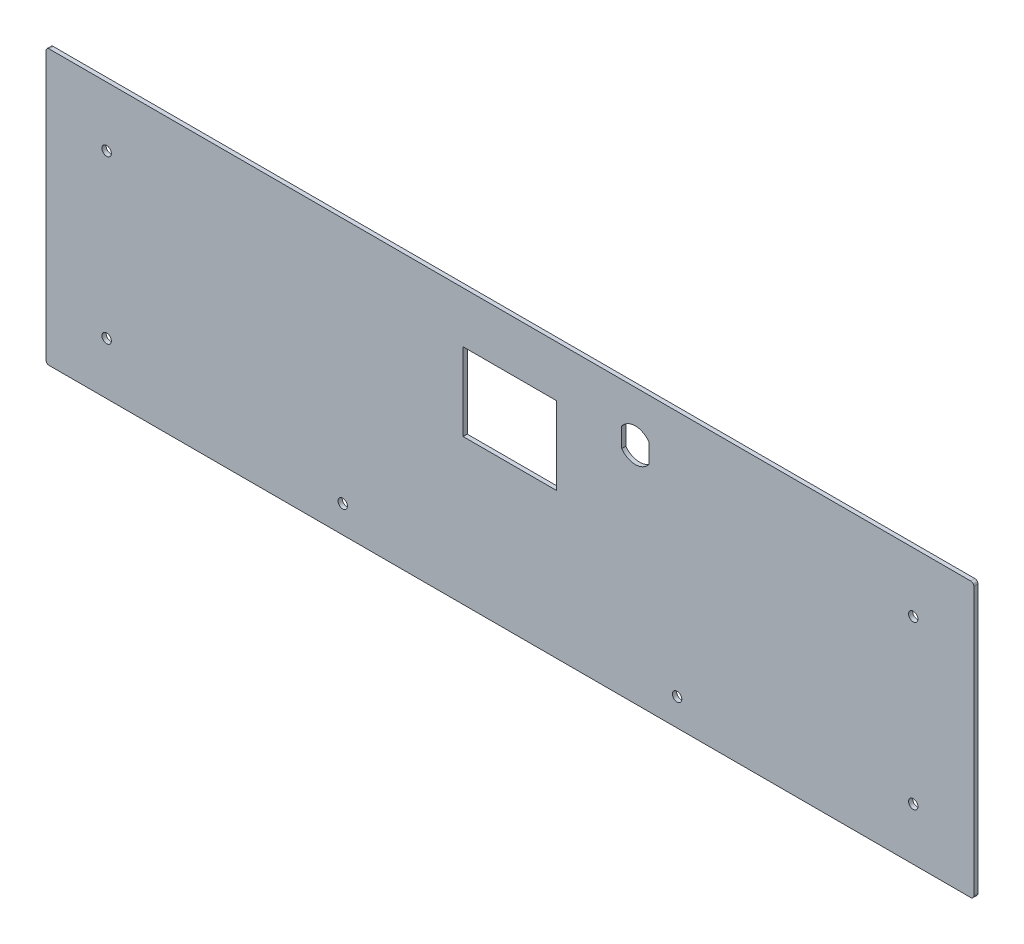
ISO-10303-21;
HEADER;
FILE_DESCRIPTION(('STEP AP214'),'2;1');
FILE_NAME('part.step','',(''),(''),'','','');
FILE_SCHEMA(('AUTOMOTIVE_DESIGN { 1 0 10303 214 1 1 1 1 }'));
ENDSEC;
DATA;
#1=APPLICATION_CONTEXT('core data for automotive mechanical design processes');
#2=APPLICATION_PROTOCOL_DEFINITION('international standard','automotive_design',2000,#1);
#3=PRODUCT_CONTEXT('',#1,'mechanical');
#4=PRODUCT('Part','Part','',(#3));
#5=PRODUCT_RELATED_PRODUCT_CATEGORY('part','',(#4));
#6=PRODUCT_DEFINITION_FORMATION('','',#4);
#7=PRODUCT_DEFINITION_CONTEXT('part definition',#1,'design');
#8=PRODUCT_DEFINITION('design','',#6,#7);
#9=PRODUCT_DEFINITION_SHAPE('','',#8);
#10=(LENGTH_UNIT() NAMED_UNIT(*) SI_UNIT(.MILLI.,.METRE.));
#11=(NAMED_UNIT(*) PLANE_ANGLE_UNIT() SI_UNIT($,.RADIAN.));
#12=(NAMED_UNIT(*) SI_UNIT($,.STERADIAN.) SOLID_ANGLE_UNIT());
#13=UNCERTAINTY_MEASURE_WITH_UNIT(LENGTH_MEASURE(1.E-05),#10,'distance_accuracy_value','');
#14=(GEOMETRIC_REPRESENTATION_CONTEXT(3) GLOBAL_UNCERTAINTY_ASSIGNED_CONTEXT((#13)) GLOBAL_UNIT_ASSIGNED_CONTEXT((#10,
#11,#12)) REPRESENTATION_CONTEXT('',''));
#15=CARTESIAN_POINT('',(0.,0.,0.));
#16=DIRECTION('',(0.,0.,1.));
#17=DIRECTION('',(1.,0.,0.));
#18=AXIS2_PLACEMENT_3D('',#15,#16,#17);
#19=CARTESIAN_POINT('',(0.,0.,-2.));
#20=DIRECTION('',(0.,0.,-1.));
#21=DIRECTION('',(-1.,0.,0.));
#22=AXIS2_PLACEMENT_3D('',#19,#20,#21);
#23=PLANE('',#22);
#24=CARTESIAN_POINT('',(-80.,13.,-2.));
#25=DIRECTION('',(0.,0.,1.));
#26=DIRECTION('',(1.,0.,0.));
#27=AXIS2_PLACEMENT_3D('',#24,#25,#26);
#28=CIRCLE('',#27,2.25);
#29=CARTESIAN_POINT('',(-77.75,13.,-2.));
#30=VERTEX_POINT('',#29);
#31=EDGE_CURVE('E179',#30,#30,#28,.T.);
#32=ORIENTED_EDGE('',*,*,#31,.T.);
#33=EDGE_LOOP('',(#32));
#34=FACE_BOUND('',#33,.T.);
#35=CARTESIAN_POINT('',(-193.,25.,-2.));
#36=DIRECTION('',(0.,0.,1.));
#37=DIRECTION('',(1.,0.,0.));
#38=AXIS2_PLACEMENT_3D('',#35,#36,#37);
#39=CIRCLE('',#38,2.25);
#40=CARTESIAN_POINT('',(-190.75,25.,-2.));
#41=VERTEX_POINT('',#40);
#42=EDGE_CURVE('E182',#41,#41,#39,.T.);
#43=ORIENTED_EDGE('',*,*,#42,.T.);
#44=EDGE_LOOP('',(#43));
#45=FACE_BOUND('',#44,.T.);
#46=CARTESIAN_POINT('',(-193.,102.7,-2.));
#47=DIRECTION('',(0.,0.,1.));
#48=DIRECTION('',(1.,0.,0.));
#49=AXIS2_PLACEMENT_3D('',#46,#47,#48);
#50=CIRCLE('',#49,2.25);
#51=CARTESIAN_POINT('',(-190.75,102.7,-2.));
#52=VERTEX_POINT('',#51);
#53=EDGE_CURVE('E185',#52,#52,#50,.T.);
#54=ORIENTED_EDGE('',*,*,#53,.T.);
#55=EDGE_LOOP('',(#54));
#56=FACE_BOUND('',#55,.T.);
#57=DIRECTION('',(1.,0.,0.));
#58=VECTOR('',#57,1.);
#59=CARTESIAN_POINT('',(0.,0.,-2.));
#60=LINE('',#59,#58);
#61=CARTESIAN_POINT('',(-220.5,0.,-2.));
#62=VERTEX_POINT('',#61);
#63=CARTESIAN_POINT('',(220.5,0.,-2.));
#64=VERTEX_POINT('',#63);
#65=EDGE_CURVE('E221',#62,#64,#60,.T.);
#66=ORIENTED_EDGE('',*,*,#65,.F.);
#67=CARTESIAN_POINT('',(-220.5,1.5,-2.));
#68=DIRECTION('',(0.,0.,1.));
#69=DIRECTION('',(1.,0.,0.));
#70=AXIS2_PLACEMENT_3D('',#67,#68,#69);
#71=CIRCLE('',#70,1.5);
#72=CARTESIAN_POINT('',(-222.,1.5,-2.));
#73=VERTEX_POINT('',#72);
#74=EDGE_CURVE('E193',#73,#62,#71,.T.);
#75=ORIENTED_EDGE('',*,*,#74,.F.);
#76=DIRECTION('',(0.,1.,0.));
#77=VECTOR('',#76,1.);
#78=CARTESIAN_POINT('',(-222.,0.,-2.));
#79=LINE('',#78,#77);
#80=CARTESIAN_POINT('',(-222.,129.7,-2.));
#81=VERTEX_POINT('',#80);
#82=EDGE_CURVE('E220',#81,#73,#79,.F.);
#83=ORIENTED_EDGE('',*,*,#82,.F.);
#84=CARTESIAN_POINT('',(-220.5,129.7,-2.));
#85=DIRECTION('',(0.,0.,1.));
#86=DIRECTION('',(1.,0.,0.));
#87=AXIS2_PLACEMENT_3D('',#84,#85,#86);
#88=CIRCLE('',#87,1.5);
#89=CARTESIAN_POINT('',(-220.5,131.2,-2.));
#90=VERTEX_POINT('',#89);
#91=EDGE_CURVE('E189',#90,#81,#88,.T.);
#92=ORIENTED_EDGE('',*,*,#91,.F.);
#93=DIRECTION('',(1.,0.,0.));
#94=VECTOR('',#93,1.);
#95=CARTESIAN_POINT('',(0.,131.2,-2.));
#96=LINE('',#95,#94);
#97=CARTESIAN_POINT('',(220.5,131.2,-2.));
#98=VERTEX_POINT('',#97);
#99=EDGE_CURVE('E218',#98,#90,#96,.F.);
#100=ORIENTED_EDGE('',*,*,#99,.F.);
#101=CARTESIAN_POINT('',(220.5,129.7,-2.));
#102=DIRECTION('',(0.,0.,1.));
#103=DIRECTION('',(1.,0.,0.));
#104=AXIS2_PLACEMENT_3D('',#101,#102,#103);
#105=CIRCLE('',#104,1.5);
#106=CARTESIAN_POINT('',(222.,129.7,-2.));
#107=VERTEX_POINT('',#106);
#108=EDGE_CURVE('E201',#107,#98,#105,.T.);
#109=ORIENTED_EDGE('',*,*,#108,.F.);
#110=DIRECTION('',(0.,1.,0.));
#111=VECTOR('',#110,1.);
#112=CARTESIAN_POINT('',(222.,0.,-2.));
#113=LINE('',#112,#111);
#114=CARTESIAN_POINT('',(222.,1.5,-2.));
#115=VERTEX_POINT('',#114);
#116=EDGE_CURVE('E137',#115,#107,#113,.T.);
#117=ORIENTED_EDGE('',*,*,#116,.F.);
#118=CARTESIAN_POINT('',(220.5,1.5,-2.));
#119=DIRECTION('',(0.,0.,1.));
#120=DIRECTION('',(1.,0.,0.));
#121=AXIS2_PLACEMENT_3D('',#118,#119,#120);
#122=CIRCLE('',#121,1.5);
#123=EDGE_CURVE('E197',#64,#115,#122,.T.);
#124=ORIENTED_EDGE('',*,*,#123,.F.);
#125=EDGE_LOOP('',(#66,#75,#83,#92,#100,#109,#117,#124));
#126=FACE_BOUND('',#125,.T.);
#127=CARTESIAN_POINT('',(80.,13.,-2.));
#128=DIRECTION('',(0.,0.,1.));
#129=DIRECTION('',(1.,0.,0.));
#130=AXIS2_PLACEMENT_3D('',#127,#128,#129);
#131=CIRCLE('',#130,2.25);
#132=CARTESIAN_POINT('',(82.25,13.,-2.));
#133=VERTEX_POINT('',#132);
#134=EDGE_CURVE('E203',#133,#133,#131,.T.);
#135=ORIENTED_EDGE('',*,*,#134,.T.);
#136=EDGE_LOOP('',(#135));
#137=FACE_BOUND('',#136,.T.);
#138=CARTESIAN_POINT('',(193.,25.,-2.));
#139=DIRECTION('',(0.,0.,1.));
#140=DIRECTION('',(1.,0.,0.));
#141=AXIS2_PLACEMENT_3D('',#138,#139,#140);
#142=CIRCLE('',#141,2.25);
#143=CARTESIAN_POINT('',(195.25,25.,-2.));
#144=VERTEX_POINT('',#143);
#145=EDGE_CURVE('E206',#144,#144,#142,.T.);
#146=ORIENTED_EDGE('',*,*,#145,.T.);
#147=EDGE_LOOP('',(#146));
#148=FACE_BOUND('',#147,.T.);
#149=CARTESIAN_POINT('',(193.,102.7,-2.));
#150=DIRECTION('',(0.,0.,1.));
#151=DIRECTION('',(1.,0.,0.));
#152=AXIS2_PLACEMENT_3D('',#149,#150,#151);
#153=CIRCLE('',#152,2.25);
#154=CARTESIAN_POINT('',(195.25,102.7,-2.));
#155=VERTEX_POINT('',#154);
#156=EDGE_CURVE('E209',#155,#155,#153,.T.);
#157=ORIENTED_EDGE('',*,*,#156,.T.);
#158=EDGE_LOOP('',(#157));
#159=FACE_BOUND('',#158,.T.);
#160=DIRECTION('',(0.,-1.,0.));
#161=VECTOR('',#160,1.);
#162=CARTESIAN_POINT('',(-22.4,106.8,-2.));
#163=LINE('',#162,#161);
#164=CARTESIAN_POINT('',(-22.4,106.8,-2.));
#165=VERTEX_POINT('',#164);
#166=CARTESIAN_POINT('',(-22.4,69.6,-2.));
#167=VERTEX_POINT('',#166);
#168=EDGE_CURVE('E129',#165,#167,#163,.T.);
#169=ORIENTED_EDGE('',*,*,#168,.T.);
#170=DIRECTION('',(1.,0.,0.));
#171=VECTOR('',#170,1.);
#172=CARTESIAN_POINT('',(-22.4,69.6,-2.));
#173=LINE('',#172,#171);
#174=CARTESIAN_POINT('',(22.4,69.6,-2.));
#175=VERTEX_POINT('',#174);
#176=EDGE_CURVE('E248',#167,#175,#173,.T.);
#177=ORIENTED_EDGE('',*,*,#176,.T.);
#178=DIRECTION('',(0.,1.,0.));
#179=VECTOR('',#178,1.);
#180=CARTESIAN_POINT('',(22.4,106.8,-2.));
#181=LINE('',#180,#179);
#182=CARTESIAN_POINT('',(22.4,106.8,-2.));
#183=VERTEX_POINT('',#182);
#184=EDGE_CURVE('E242',#175,#183,#181,.T.);
#185=ORIENTED_EDGE('',*,*,#184,.T.);
#186=DIRECTION('',(1.,0.,0.));
#187=VECTOR('',#186,1.);
#188=CARTESIAN_POINT('',(-22.4,106.8,-2.));
#189=LINE('',#188,#187);
#190=EDGE_CURVE('E211',#183,#165,#189,.F.);
#191=ORIENTED_EDGE('',*,*,#190,.T.);
#192=EDGE_LOOP('',(#169,#177,#185,#191));
#193=FACE_BOUND('',#192,.T.);
#194=CARTESIAN_POINT('',(60.,107.2,-2.));
#195=DIRECTION('',(0.,0.,1.));
#196=DIRECTION('',(1.,0.,0.));
#197=AXIS2_PLACEMENT_3D('',#194,#195,#196);
#198=CIRCLE('',#197,8.00000000000002);
#199=CARTESIAN_POINT('',(66.5,111.863689526544,-2.));
#200=VERTEX_POINT('',#199);
#201=CARTESIAN_POINT('',(53.5,111.863689526544,-2.));
#202=VERTEX_POINT('',#201);
#203=EDGE_CURVE('E20',#200,#202,#198,.T.);
#204=ORIENTED_EDGE('',*,*,#203,.T.);
#205=DIRECTION('',(0.,-1.,0.));
#206=VECTOR('',#205,1.);
#207=CARTESIAN_POINT('',(53.5,111.863689526544,-2.));
#208=LINE('',#207,#206);
#209=CARTESIAN_POINT('',(53.5,102.536310473456,-2.));
#210=VERTEX_POINT('',#209);
#211=EDGE_CURVE('E139',#202,#210,#208,.T.);
#212=ORIENTED_EDGE('',*,*,#211,.T.);
#213=CARTESIAN_POINT('',(60.,107.2,-2.));
#214=DIRECTION('',(0.,0.,1.));
#215=DIRECTION('',(1.,0.,0.));
#216=AXIS2_PLACEMENT_3D('',#213,#214,#215);
#217=CIRCLE('',#216,8.00000000000001);
#218=CARTESIAN_POINT('',(66.5,102.536310473456,-2.));
#219=VERTEX_POINT('',#218);
#220=EDGE_CURVE('E126',#210,#219,#217,.T.);
#221=ORIENTED_EDGE('',*,*,#220,.T.);
#222=DIRECTION('',(0.,1.,0.));
#223=VECTOR('',#222,1.);
#224=CARTESIAN_POINT('',(66.5,111.863689526544,-2.));
#225=LINE('',#224,#223);
#226=EDGE_CURVE('E121',#219,#200,#225,.T.);
#227=ORIENTED_EDGE('',*,*,#226,.T.);
#228=EDGE_LOOP('',(#204,#212,#221,#227));
#229=FACE_BOUND('',#228,.T.);
#230=ADVANCED_FACE('F17',(#34,#45,#56,#126,#137,#148,#159,#193,#229),#23,.T.);
#231=CARTESIAN_POINT('',(60.,107.2,-10.));
#232=DIRECTION('',(0.,0.,1.));
#233=DIRECTION('',(1.,0.,0.));
#234=AXIS2_PLACEMENT_3D('',#231,#232,#233);
#235=CYLINDRICAL_SURFACE('',#234,8.00000000000002);
#236=DIRECTION('',(0.,0.,-1.));
#237=VECTOR('',#236,1.);
#238=CARTESIAN_POINT('',(66.5,111.863689526544,-10.));
#239=LINE('',#238,#237);
#240=CARTESIAN_POINT('',(66.5,111.863689526544,0.));
#241=VERTEX_POINT('',#240);
#242=EDGE_CURVE('E112',#200,#241,#239,.F.);
#243=ORIENTED_EDGE('',*,*,#242,.T.);
#244=CARTESIAN_POINT('',(60.,107.2,0.));
#245=DIRECTION('',(0.,0.,1.));
#246=DIRECTION('',(1.,0.,0.));
#247=AXIS2_PLACEMENT_3D('',#244,#245,#246);
#248=CIRCLE('',#247,8.00000000000002);
#249=CARTESIAN_POINT('',(53.5,111.863689526544,0.));
#250=VERTEX_POINT('',#249);
#251=EDGE_CURVE('E177',#241,#250,#248,.T.);
#252=ORIENTED_EDGE('',*,*,#251,.T.);
#253=DIRECTION('',(0.,0.,1.));
#254=VECTOR('',#253,1.);
#255=CARTESIAN_POINT('',(53.5,111.863689526544,-10.));
#256=LINE('',#255,#254);
#257=EDGE_CURVE('E114',#250,#202,#256,.F.);
#258=ORIENTED_EDGE('',*,*,#257,.T.);
#259=ORIENTED_EDGE('',*,*,#203,.F.);
#260=EDGE_LOOP('',(#243,#252,#258,#259));
#261=FACE_BOUND('',#260,.T.);
#262=ADVANCED_FACE('F110',(#261),#235,.F.);
#263=CARTESIAN_POINT('',(53.5,111.863689526544,-10.));
#264=DIRECTION('',(-1.,0.,0.));
#265=DIRECTION('',(0.,-1.,0.));
#266=AXIS2_PLACEMENT_3D('',#263,#264,#265);
#267=PLANE('',#266);
#268=ORIENTED_EDGE('',*,*,#257,.F.);
#269=DIRECTION('',(0.,1.,0.));
#270=VECTOR('',#269,1.);
#271=CARTESIAN_POINT('',(53.5,0.,0.));
#272=LINE('',#271,#270);
#273=CARTESIAN_POINT('',(53.5,102.536310473456,0.));
#274=VERTEX_POINT('',#273);
#275=EDGE_CURVE('E176',#250,#274,#272,.F.);
#276=ORIENTED_EDGE('',*,*,#275,.T.);
#277=DIRECTION('',(0.,0.,1.));
#278=VECTOR('',#277,1.);
#279=CARTESIAN_POINT('',(53.5,102.536310473456,-10.));
#280=LINE('',#279,#278);
#281=EDGE_CURVE('E140',#274,#210,#280,.F.);
#282=ORIENTED_EDGE('',*,*,#281,.T.);
#283=ORIENTED_EDGE('',*,*,#211,.F.);
#284=EDGE_LOOP('',(#268,#276,#282,#283));
#285=FACE_BOUND('',#284,.T.);
#286=ADVANCED_FACE('F330',(#285),#267,.F.);
#287=CARTESIAN_POINT('',(60.,107.2,-10.));
#288=DIRECTION('',(0.,0.,1.));
#289=DIRECTION('',(1.,0.,0.));
#290=AXIS2_PLACEMENT_3D('',#287,#288,#289);
#291=CYLINDRICAL_SURFACE('',#290,8.00000000000001);
#292=ORIENTED_EDGE('',*,*,#281,.F.);
#293=CARTESIAN_POINT('',(60.,107.2,0.));
#294=DIRECTION('',(0.,0.,1.));
#295=DIRECTION('',(1.,0.,0.));
#296=AXIS2_PLACEMENT_3D('',#293,#294,#295);
#297=CIRCLE('',#296,8.00000000000001);
#298=CARTESIAN_POINT('',(66.5,102.536310473456,0.));
#299=VERTEX_POINT('',#298);
#300=EDGE_CURVE('E173',#274,#299,#297,.T.);
#301=ORIENTED_EDGE('',*,*,#300,.T.);
#302=DIRECTION('',(0.,0.,-1.));
#303=VECTOR('',#302,1.);
#304=CARTESIAN_POINT('',(66.5,102.536310473456,-10.));
#305=LINE('',#304,#303);
#306=EDGE_CURVE('E125',#299,#219,#305,.T.);
#307=ORIENTED_EDGE('',*,*,#306,.T.);
#308=ORIENTED_EDGE('',*,*,#220,.F.);
#309=EDGE_LOOP('',(#292,#301,#307,#308));
#310=FACE_BOUND('',#309,.T.);
#311=ADVANCED_FACE('F401',(#310),#291,.F.);
#312=CARTESIAN_POINT('',(66.5,111.863689526544,-10.));
#313=DIRECTION('',(1.,0.,0.));
#314=DIRECTION('',(0.,0.,-1.));
#315=AXIS2_PLACEMENT_3D('',#312,#313,#314);
#316=PLANE('',#315);
#317=ORIENTED_EDGE('',*,*,#306,.F.);
#318=DIRECTION('',(0.,1.,0.));
#319=VECTOR('',#318,1.);
#320=CARTESIAN_POINT('',(66.5,0.,0.));
#321=LINE('',#320,#319);
#322=EDGE_CURVE('E124',#299,#241,#321,.T.);
#323=ORIENTED_EDGE('',*,*,#322,.T.);
#324=ORIENTED_EDGE('',*,*,#242,.F.);
#325=ORIENTED_EDGE('',*,*,#226,.F.);
#326=EDGE_LOOP('',(#317,#323,#324,#325));
#327=FACE_BOUND('',#326,.T.);
#328=ADVANCED_FACE('F120',(#327),#316,.F.);
#329=CARTESIAN_POINT('',(-22.4,106.8,-10.));
#330=DIRECTION('',(-1.,0.,0.));
#331=DIRECTION('',(0.,-1.,0.));
#332=AXIS2_PLACEMENT_3D('',#329,#330,#331);
#333=PLANE('',#332);
#334=DIRECTION('',(0.,0.,1.));
#335=VECTOR('',#334,1.);
#336=CARTESIAN_POINT('',(-22.4,106.8,-10.));
#337=LINE('',#336,#335);
#338=CARTESIAN_POINT('',(-22.4,106.8,0.));
#339=VERTEX_POINT('',#338);
#340=EDGE_CURVE('E239',#165,#339,#337,.T.);
#341=ORIENTED_EDGE('',*,*,#340,.T.);
#342=DIRECTION('',(0.,1.,0.));
#343=VECTOR('',#342,1.);
#344=CARTESIAN_POINT('',(-22.4,0.,0.));
#345=LINE('',#344,#343);
#346=CARTESIAN_POINT('',(-22.4,69.6,0.));
#347=VERTEX_POINT('',#346);
#348=EDGE_CURVE('E261',#339,#347,#345,.F.);
#349=ORIENTED_EDGE('',*,*,#348,.T.);
#350=DIRECTION('',(0.,0.,-1.));
#351=VECTOR('',#350,1.);
#352=CARTESIAN_POINT('',(-22.4,69.6,-10.));
#353=LINE('',#352,#351);
#354=EDGE_CURVE('E132',#347,#167,#353,.T.);
#355=ORIENTED_EDGE('',*,*,#354,.T.);
#356=ORIENTED_EDGE('',*,*,#168,.F.);
#357=EDGE_LOOP('',(#341,#349,#355,#356));
#358=FACE_BOUND('',#357,.T.);
#359=ADVANCED_FACE('F256',(#358),#333,.F.);
#360=CARTESIAN_POINT('',(-22.4,69.6,-10.));
#361=DIRECTION('',(0.,-1.,0.));
#362=DIRECTION('',(0.,0.,-1.));
#363=AXIS2_PLACEMENT_3D('',#360,#361,#362);
#364=PLANE('',#363);
#365=ORIENTED_EDGE('',*,*,#354,.F.);
#366=DIRECTION('',(-1.,0.,0.));
#367=VECTOR('',#366,1.);
#368=CARTESIAN_POINT('',(0.,69.6,0.));
#369=LINE('',#368,#367);
#370=CARTESIAN_POINT('',(22.4,69.6,0.));
#371=VERTEX_POINT('',#370);
#372=EDGE_CURVE('E269',#347,#371,#369,.F.);
#373=ORIENTED_EDGE('',*,*,#372,.T.);
#374=DIRECTION('',(0.,0.,1.));
#375=VECTOR('',#374,1.);
#376=CARTESIAN_POINT('',(22.4,69.6,-10.));
#377=LINE('',#376,#375);
#378=EDGE_CURVE('E245',#371,#175,#377,.F.);
#379=ORIENTED_EDGE('',*,*,#378,.T.);
#380=ORIENTED_EDGE('',*,*,#176,.F.);
#381=EDGE_LOOP('',(#365,#373,#379,#380));
#382=FACE_BOUND('',#381,.T.);
#383=ADVANCED_FACE('F267',(#382),#364,.F.);
#384=CARTESIAN_POINT('',(22.4,106.8,-10.));
#385=DIRECTION('',(1.,0.,0.));
#386=DIRECTION('',(0.,1.,0.));
#387=AXIS2_PLACEMENT_3D('',#384,#385,#386);
#388=PLANE('',#387);
#389=ORIENTED_EDGE('',*,*,#378,.F.);
#390=DIRECTION('',(0.,1.,0.));
#391=VECTOR('',#390,1.);
#392=CARTESIAN_POINT('',(22.4,0.,0.));
#393=LINE('',#392,#391);
#394=CARTESIAN_POINT('',(22.4,106.8,0.));
#395=VERTEX_POINT('',#394);
#396=EDGE_CURVE('E277',#371,#395,#393,.T.);
#397=ORIENTED_EDGE('',*,*,#396,.T.);
#398=DIRECTION('',(0.,0.,1.));
#399=VECTOR('',#398,1.);
#400=CARTESIAN_POINT('',(22.4,106.8,-10.));
#401=LINE('',#400,#399);
#402=EDGE_CURVE('E236',#395,#183,#401,.F.);
#403=ORIENTED_EDGE('',*,*,#402,.T.);
#404=ORIENTED_EDGE('',*,*,#184,.F.);
#405=EDGE_LOOP('',(#389,#397,#403,#404));
#406=FACE_BOUND('',#405,.T.);
#407=ADVANCED_FACE('F317',(#406),#388,.F.);
#408=CARTESIAN_POINT('',(-22.4,106.8,-10.));
#409=DIRECTION('',(0.,1.,0.));
#410=DIRECTION('',(0.,0.,1.));
#411=AXIS2_PLACEMENT_3D('',#408,#409,#410);
#412=PLANE('',#411);
#413=ORIENTED_EDGE('',*,*,#402,.F.);
#414=DIRECTION('',(-1.,0.,0.));
#415=VECTOR('',#414,1.);
#416=CARTESIAN_POINT('',(0.,106.8,0.));
#417=LINE('',#416,#415);
#418=EDGE_CURVE('E172',#395,#339,#417,.T.);
#419=ORIENTED_EDGE('',*,*,#418,.T.);
#420=ORIENTED_EDGE('',*,*,#340,.F.);
#421=ORIENTED_EDGE('',*,*,#190,.F.);
#422=EDGE_LOOP('',(#413,#419,#420,#421));
#423=FACE_BOUND('',#422,.T.);
#424=ADVANCED_FACE('F311',(#423),#412,.F.);
#425=CARTESIAN_POINT('',(193.,102.7,-10.));
#426=DIRECTION('',(0.,0.,1.));
#427=DIRECTION('',(1.,0.,0.));
#428=AXIS2_PLACEMENT_3D('',#425,#426,#427);
#429=CYLINDRICAL_SURFACE('',#428,2.25);
#430=ORIENTED_EDGE('',*,*,#156,.F.);
#431=EDGE_LOOP('',(#430));
#432=FACE_BOUND('',#431,.T.);
#433=CARTESIAN_POINT('',(193.,102.7,0.));
#434=DIRECTION('',(0.,0.,1.));
#435=DIRECTION('',(1.,0.,0.));
#436=AXIS2_PLACEMENT_3D('',#433,#434,#435);
#437=CIRCLE('',#436,2.25);
#438=CARTESIAN_POINT('',(195.25,102.7,0.));
#439=VERTEX_POINT('',#438);
#440=EDGE_CURVE('E169',#439,#439,#437,.T.);
#441=ORIENTED_EDGE('',*,*,#440,.T.);
#442=EDGE_LOOP('',(#441));
#443=FACE_BOUND('',#442,.T.);
#444=ADVANCED_FACE('F386',(#432,#443),#429,.F.);
#445=CARTESIAN_POINT('',(193.,25.,-10.));
#446=DIRECTION('',(0.,0.,1.));
#447=DIRECTION('',(1.,0.,0.));
#448=AXIS2_PLACEMENT_3D('',#445,#446,#447);
#449=CYLINDRICAL_SURFACE('',#448,2.25);
#450=ORIENTED_EDGE('',*,*,#145,.F.);
#451=EDGE_LOOP('',(#450));
#452=FACE_BOUND('',#451,.T.);
#453=CARTESIAN_POINT('',(193.,25.,0.));
#454=DIRECTION('',(0.,0.,1.));
#455=DIRECTION('',(1.,0.,0.));
#456=AXIS2_PLACEMENT_3D('',#453,#454,#455);
#457=CIRCLE('',#456,2.25);
#458=CARTESIAN_POINT('',(195.25,25.,0.));
#459=VERTEX_POINT('',#458);
#460=EDGE_CURVE('E166',#459,#459,#457,.T.);
#461=ORIENTED_EDGE('',*,*,#460,.T.);
#462=EDGE_LOOP('',(#461));
#463=FACE_BOUND('',#462,.T.);
#464=ADVANCED_FACE('F382',(#452,#463),#449,.F.);
#465=CARTESIAN_POINT('',(80.,13.,-10.));
#466=DIRECTION('',(0.,0.,1.));
#467=DIRECTION('',(1.,0.,0.));
#468=AXIS2_PLACEMENT_3D('',#465,#466,#467);
#469=CYLINDRICAL_SURFACE('',#468,2.25);
#470=ORIENTED_EDGE('',*,*,#134,.F.);
#471=EDGE_LOOP('',(#470));
#472=FACE_BOUND('',#471,.T.);
#473=CARTESIAN_POINT('',(80.,13.,0.));
#474=DIRECTION('',(0.,0.,1.));
#475=DIRECTION('',(1.,0.,0.));
#476=AXIS2_PLACEMENT_3D('',#473,#474,#475);
#477=CIRCLE('',#476,2.25);
#478=CARTESIAN_POINT('',(82.25,13.,0.));
#479=VERTEX_POINT('',#478);
#480=EDGE_CURVE('E163',#479,#479,#477,.T.);
#481=ORIENTED_EDGE('',*,*,#480,.T.);
#482=EDGE_LOOP('',(#481));
#483=FACE_BOUND('',#482,.T.);
#484=ADVANCED_FACE('F378',(#472,#483),#469,.F.);
#485=CARTESIAN_POINT('',(220.5,129.7,-2.));
#486=DIRECTION('',(0.,0.,1.));
#487=DIRECTION('',(1.,0.,0.));
#488=AXIS2_PLACEMENT_3D('',#485,#486,#487);
#489=CYLINDRICAL_SURFACE('',#488,1.5);
#490=CARTESIAN_POINT('',(220.5,129.7,0.));
#491=DIRECTION('',(0.,0.,1.));
#492=DIRECTION('',(1.,0.,0.));
#493=AXIS2_PLACEMENT_3D('',#490,#491,#492);
#494=CIRCLE('',#493,1.5);
#495=CARTESIAN_POINT('',(220.5,131.2,0.));
#496=VERTEX_POINT('',#495);
#497=CARTESIAN_POINT('',(222.,129.7,0.));
#498=VERTEX_POINT('',#497);
#499=EDGE_CURVE('E160',#496,#498,#494,.F.);
#500=ORIENTED_EDGE('',*,*,#499,.T.);
#501=DIRECTION('',(0.,0.,-1.));
#502=VECTOR('',#501,1.);
#503=CARTESIAN_POINT('',(222.,129.7,-2.));
#504=LINE('',#503,#502);
#505=EDGE_CURVE('E200',#107,#498,#504,.F.);
#506=ORIENTED_EDGE('',*,*,#505,.F.);
#507=ORIENTED_EDGE('',*,*,#108,.T.);
#508=DIRECTION('',(0.,0.,1.));
#509=VECTOR('',#508,1.);
#510=CARTESIAN_POINT('',(220.5,131.2,-2.));
#511=LINE('',#510,#509);
#512=EDGE_CURVE('E188',#496,#98,#511,.F.);
#513=ORIENTED_EDGE('',*,*,#512,.F.);
#514=EDGE_LOOP('',(#500,#506,#507,#513));
#515=FACE_BOUND('',#514,.T.);
#516=ADVANCED_FACE('F374',(#515),#489,.T.);
#517=CARTESIAN_POINT('',(222.,0.,-2.));
#518=DIRECTION('',(1.,0.,0.));
#519=DIRECTION('',(0.,0.,-1.));
#520=AXIS2_PLACEMENT_3D('',#517,#518,#519);
#521=PLANE('',#520);
#522=DIRECTION('',(0.,1.,0.));
#523=VECTOR('',#522,1.);
#524=CARTESIAN_POINT('',(222.,0.,0.));
#525=LINE('',#524,#523);
#526=CARTESIAN_POINT('',(222.,1.5,0.));
#527=VERTEX_POINT('',#526);
#528=EDGE_CURVE('E159',#498,#527,#525,.F.);
#529=ORIENTED_EDGE('',*,*,#528,.T.);
#530=DIRECTION('',(0.,0.,1.));
#531=VECTOR('',#530,1.);
#532=CARTESIAN_POINT('',(222.,1.5,-2.));
#533=LINE('',#532,#531);
#534=EDGE_CURVE('E199',#115,#527,#533,.T.);
#535=ORIENTED_EDGE('',*,*,#534,.F.);
#536=ORIENTED_EDGE('',*,*,#116,.T.);
#537=ORIENTED_EDGE('',*,*,#505,.T.);
#538=EDGE_LOOP('',(#529,#535,#536,#537));
#539=FACE_BOUND('',#538,.T.);
#540=ADVANCED_FACE('F371',(#539),#521,.T.);
#541=CARTESIAN_POINT('',(220.5,1.5,-2.));
#542=DIRECTION('',(0.,0.,1.));
#543=DIRECTION('',(1.,0.,0.));
#544=AXIS2_PLACEMENT_3D('',#541,#542,#543);
#545=CYLINDRICAL_SURFACE('',#544,1.5);
#546=CARTESIAN_POINT('',(220.5,1.5,0.));
#547=DIRECTION('',(0.,0.,1.));
#548=DIRECTION('',(1.,0.,0.));
#549=AXIS2_PLACEMENT_3D('',#546,#547,#548);
#550=CIRCLE('',#549,1.5);
#551=CARTESIAN_POINT('',(220.5,0.,0.));
#552=VERTEX_POINT('',#551);
#553=EDGE_CURVE('E156',#527,#552,#550,.F.);
#554=ORIENTED_EDGE('',*,*,#553,.T.);
#555=DIRECTION('',(0.,0.,-1.));
#556=VECTOR('',#555,1.);
#557=CARTESIAN_POINT('',(220.5,0.,-2.));
#558=LINE('',#557,#556);
#559=EDGE_CURVE('E196',#64,#552,#558,.F.);
#560=ORIENTED_EDGE('',*,*,#559,.F.);
#561=ORIENTED_EDGE('',*,*,#123,.T.);
#562=ORIENTED_EDGE('',*,*,#534,.T.);
#563=EDGE_LOOP('',(#554,#560,#561,#562));
#564=FACE_BOUND('',#563,.T.);
#565=ADVANCED_FACE('F368',(#564),#545,.T.);
#566=CARTESIAN_POINT('',(0.,0.,-2.));
#567=DIRECTION('',(0.,-1.,0.));
#568=DIRECTION('',(0.,0.,-1.));
#569=AXIS2_PLACEMENT_3D('',#566,#567,#568);
#570=PLANE('',#569);
#571=DIRECTION('',(-1.,0.,0.));
#572=VECTOR('',#571,1.);
#573=CARTESIAN_POINT('',(0.,0.,0.));
#574=LINE('',#573,#572);
#575=CARTESIAN_POINT('',(-220.5,0.,0.));
#576=VERTEX_POINT('',#575);
#577=EDGE_CURVE('E155',#552,#576,#574,.T.);
#578=ORIENTED_EDGE('',*,*,#577,.T.);
#579=DIRECTION('',(0.,0.,1.));
#580=VECTOR('',#579,1.);
#581=CARTESIAN_POINT('',(-220.5,0.,-2.));
#582=LINE('',#581,#580);
#583=EDGE_CURVE('E195',#62,#576,#582,.T.);
#584=ORIENTED_EDGE('',*,*,#583,.F.);
#585=ORIENTED_EDGE('',*,*,#65,.T.);
#586=ORIENTED_EDGE('',*,*,#559,.T.);
#587=EDGE_LOOP('',(#578,#584,#585,#586));
#588=FACE_BOUND('',#587,.T.);
#589=ADVANCED_FACE('F301',(#588),#570,.T.);
#590=CARTESIAN_POINT('',(-220.5,1.5,-2.));
#591=DIRECTION('',(0.,0.,1.));
#592=DIRECTION('',(1.,0.,0.));
#593=AXIS2_PLACEMENT_3D('',#590,#591,#592);
#594=CYLINDRICAL_SURFACE('',#593,1.5);
#595=CARTESIAN_POINT('',(-220.5,1.5,0.));
#596=DIRECTION('',(0.,0.,1.));
#597=DIRECTION('',(1.,0.,0.));
#598=AXIS2_PLACEMENT_3D('',#595,#596,#597);
#599=CIRCLE('',#598,1.5);
#600=CARTESIAN_POINT('',(-222.,1.5,0.));
#601=VERTEX_POINT('',#600);
#602=EDGE_CURVE('E152',#576,#601,#599,.F.);
#603=ORIENTED_EDGE('',*,*,#602,.T.);
#604=DIRECTION('',(0.,0.,1.));
#605=VECTOR('',#604,1.);
#606=CARTESIAN_POINT('',(-222.,1.5,-2.));
#607=LINE('',#606,#605);
#608=EDGE_CURVE('E192',#73,#601,#607,.T.);
#609=ORIENTED_EDGE('',*,*,#608,.F.);
#610=ORIENTED_EDGE('',*,*,#74,.T.);
#611=ORIENTED_EDGE('',*,*,#583,.T.);
#612=EDGE_LOOP('',(#603,#609,#610,#611));
#613=FACE_BOUND('',#612,.T.);
#614=ADVANCED_FACE('F291',(#613),#594,.T.);
#615=CARTESIAN_POINT('',(-222.,0.,-2.));
#616=DIRECTION('',(-1.,0.,0.));
#617=DIRECTION('',(0.,0.,1.));
#618=AXIS2_PLACEMENT_3D('',#615,#616,#617);
#619=PLANE('',#618);
#620=ORIENTED_EDGE('',*,*,#82,.T.);
#621=ORIENTED_EDGE('',*,*,#608,.T.);
#622=DIRECTION('',(0.,1.,0.));
#623=VECTOR('',#622,1.);
#624=CARTESIAN_POINT('',(-222.,0.,0.));
#625=LINE('',#624,#623);
#626=CARTESIAN_POINT('',(-222.,129.7,0.));
#627=VERTEX_POINT('',#626);
#628=EDGE_CURVE('E151',#601,#627,#625,.T.);
#629=ORIENTED_EDGE('',*,*,#628,.T.);
#630=DIRECTION('',(0.,0.,1.));
#631=VECTOR('',#630,1.);
#632=CARTESIAN_POINT('',(-222.,129.7,-2.));
#633=LINE('',#632,#631);
#634=EDGE_CURVE('E191',#81,#627,#633,.T.);
#635=ORIENTED_EDGE('',*,*,#634,.F.);
#636=EDGE_LOOP('',(#620,#621,#629,#635));
#637=FACE_BOUND('',#636,.T.);
#638=ADVANCED_FACE('F359',(#637),#619,.T.);
#639=CARTESIAN_POINT('',(-220.5,129.7,-2.));
#640=DIRECTION('',(0.,0.,1.));
#641=DIRECTION('',(1.,0.,0.));
#642=AXIS2_PLACEMENT_3D('',#639,#640,#641);
#643=CYLINDRICAL_SURFACE('',#642,1.5);
#644=CARTESIAN_POINT('',(-220.5,129.7,0.));
#645=DIRECTION('',(0.,0.,1.));
#646=DIRECTION('',(1.,0.,0.));
#647=AXIS2_PLACEMENT_3D('',#644,#645,#646);
#648=CIRCLE('',#647,1.5);
#649=CARTESIAN_POINT('',(-220.5,131.2,0.));
#650=VERTEX_POINT('',#649);
#651=EDGE_CURVE('E148',#627,#650,#648,.F.);
#652=ORIENTED_EDGE('',*,*,#651,.T.);
#653=DIRECTION('',(0.,0.,1.));
#654=VECTOR('',#653,1.);
#655=CARTESIAN_POINT('',(-220.5,131.2,-2.));
#656=LINE('',#655,#654);
#657=EDGE_CURVE('E35',#90,#650,#656,.T.);
#658=ORIENTED_EDGE('',*,*,#657,.F.);
#659=ORIENTED_EDGE('',*,*,#91,.T.);
#660=ORIENTED_EDGE('',*,*,#634,.T.);
#661=EDGE_LOOP('',(#652,#658,#659,#660));
#662=FACE_BOUND('',#661,.T.);
#663=ADVANCED_FACE('F356',(#662),#643,.T.);
#664=CARTESIAN_POINT('',(0.,131.2,-2.));
#665=DIRECTION('',(0.,1.,0.));
#666=DIRECTION('',(0.,0.,1.));
#667=AXIS2_PLACEMENT_3D('',#664,#665,#666);
#668=PLANE('',#667);
#669=DIRECTION('',(-1.,0.,0.));
#670=VECTOR('',#669,1.);
#671=CARTESIAN_POINT('',(0.,131.2,0.));
#672=LINE('',#671,#670);
#673=EDGE_CURVE('E147',#650,#496,#672,.F.);
#674=ORIENTED_EDGE('',*,*,#673,.T.);
#675=ORIENTED_EDGE('',*,*,#512,.T.);
#676=ORIENTED_EDGE('',*,*,#99,.T.);
#677=ORIENTED_EDGE('',*,*,#657,.T.);
#678=EDGE_LOOP('',(#674,#675,#676,#677));
#679=FACE_BOUND('',#678,.T.);
#680=ADVANCED_FACE('F352',(#679),#668,.T.);
#681=CARTESIAN_POINT('',(-193.,102.7,-10.));
#682=DIRECTION('',(0.,0.,1.));
#683=DIRECTION('',(1.,0.,0.));
#684=AXIS2_PLACEMENT_3D('',#681,#682,#683);
#685=CYLINDRICAL_SURFACE('',#684,2.25);
#686=CARTESIAN_POINT('',(-193.,102.7,0.));
#687=DIRECTION('',(0.,0.,1.));
#688=DIRECTION('',(1.,0.,0.));
#689=AXIS2_PLACEMENT_3D('',#686,#687,#688);
#690=CIRCLE('',#689,2.25);
#691=CARTESIAN_POINT('',(-190.75,102.7,0.));
#692=VERTEX_POINT('',#691);
#693=EDGE_CURVE('E144',#692,#692,#690,.T.);
#694=ORIENTED_EDGE('',*,*,#693,.T.);
#695=EDGE_LOOP('',(#694));
#696=FACE_BOUND('',#695,.T.);
#697=ORIENTED_EDGE('',*,*,#53,.F.);
#698=EDGE_LOOP('',(#697));
#699=FACE_BOUND('',#698,.T.);
#700=ADVANCED_FACE('F348',(#696,#699),#685,.F.);
#701=CARTESIAN_POINT('',(-193.,25.,-10.));
#702=DIRECTION('',(0.,0.,1.));
#703=DIRECTION('',(1.,0.,0.));
#704=AXIS2_PLACEMENT_3D('',#701,#702,#703);
#705=CYLINDRICAL_SURFACE('',#704,2.25);
#706=CARTESIAN_POINT('',(-193.,25.,0.));
#707=DIRECTION('',(0.,0.,1.));
#708=DIRECTION('',(1.,0.,0.));
#709=AXIS2_PLACEMENT_3D('',#706,#707,#708);
#710=CIRCLE('',#709,2.25);
#711=CARTESIAN_POINT('',(-190.75,25.,0.));
#712=VERTEX_POINT('',#711);
#713=EDGE_CURVE('E26',#712,#712,#710,.T.);
#714=ORIENTED_EDGE('',*,*,#713,.T.);
#715=EDGE_LOOP('',(#714));
#716=FACE_BOUND('',#715,.T.);
#717=ORIENTED_EDGE('',*,*,#42,.F.);
#718=EDGE_LOOP('',(#717));
#719=FACE_BOUND('',#718,.T.);
#720=ADVANCED_FACE('F340',(#716,#719),#705,.F.);
#721=CARTESIAN_POINT('',(-80.,13.,-10.));
#722=DIRECTION('',(0.,0.,1.));
#723=DIRECTION('',(1.,0.,0.));
#724=AXIS2_PLACEMENT_3D('',#721,#722,#723);
#725=CYLINDRICAL_SURFACE('',#724,2.25);
#726=CARTESIAN_POINT('',(-80.,13.,0.));
#727=DIRECTION('',(0.,0.,1.));
#728=DIRECTION('',(1.,0.,0.));
#729=AXIS2_PLACEMENT_3D('',#726,#727,#728);
#730=CIRCLE('',#729,2.25);
#731=CARTESIAN_POINT('',(-77.75,13.,0.));
#732=VERTEX_POINT('',#731);
#733=EDGE_CURVE('E11',#732,#732,#730,.T.);
#734=ORIENTED_EDGE('',*,*,#733,.T.);
#735=EDGE_LOOP('',(#734));
#736=FACE_BOUND('',#735,.T.);
#737=ORIENTED_EDGE('',*,*,#31,.F.);
#738=EDGE_LOOP('',(#737));
#739=FACE_BOUND('',#738,.T.);
#740=ADVANCED_FACE('F333',(#736,#739),#725,.F.);
#741=CARTESIAN_POINT('',(0.,0.,0.));
#742=DIRECTION('',(0.,0.,-1.));
#743=DIRECTION('',(-1.,0.,0.));
#744=AXIS2_PLACEMENT_3D('',#741,#742,#743);
#745=PLANE('',#744);
#746=ORIENTED_EDGE('',*,*,#733,.F.);
#747=EDGE_LOOP('',(#746));
#748=FACE_BOUND('',#747,.T.);
#749=ORIENTED_EDGE('',*,*,#713,.F.);
#750=EDGE_LOOP('',(#749));
#751=FACE_BOUND('',#750,.T.);
#752=ORIENTED_EDGE('',*,*,#693,.F.);
#753=EDGE_LOOP('',(#752));
#754=FACE_BOUND('',#753,.T.);
#755=ORIENTED_EDGE('',*,*,#651,.F.);
#756=ORIENTED_EDGE('',*,*,#628,.F.);
#757=ORIENTED_EDGE('',*,*,#602,.F.);
#758=ORIENTED_EDGE('',*,*,#577,.F.);
#759=ORIENTED_EDGE('',*,*,#553,.F.);
#760=ORIENTED_EDGE('',*,*,#528,.F.);
#761=ORIENTED_EDGE('',*,*,#499,.F.);
#762=ORIENTED_EDGE('',*,*,#673,.F.);
#763=EDGE_LOOP('',(#755,#756,#757,#758,#759,#760,#761,#762));
#764=FACE_BOUND('',#763,.T.);
#765=ORIENTED_EDGE('',*,*,#480,.F.);
#766=EDGE_LOOP('',(#765));
#767=FACE_BOUND('',#766,.T.);
#768=ORIENTED_EDGE('',*,*,#460,.F.);
#769=EDGE_LOOP('',(#768));
#770=FACE_BOUND('',#769,.T.);
#771=ORIENTED_EDGE('',*,*,#440,.F.);
#772=EDGE_LOOP('',(#771));
#773=FACE_BOUND('',#772,.T.);
#774=ORIENTED_EDGE('',*,*,#396,.F.);
#775=ORIENTED_EDGE('',*,*,#372,.F.);
#776=ORIENTED_EDGE('',*,*,#348,.F.);
#777=ORIENTED_EDGE('',*,*,#418,.F.);
#778=EDGE_LOOP('',(#774,#775,#776,#777));
#779=FACE_BOUND('',#778,.T.);
#780=ORIENTED_EDGE('',*,*,#300,.F.);
#781=ORIENTED_EDGE('',*,*,#275,.F.);
#782=ORIENTED_EDGE('',*,*,#251,.F.);
#783=ORIENTED_EDGE('',*,*,#322,.F.);
#784=EDGE_LOOP('',(#780,#781,#782,#783));
#785=FACE_BOUND('',#784,.T.);
#786=ADVANCED_FACE('F273',(#748,#751,#754,#764,#767,#770,#773,#779,#785),#745,.F.);
#787=CLOSED_SHELL('',(#230,#262,#286,#311,#328,#359,#383,#407,#424,#444,#464,#484,#516,#540,
#565,#589,#614,#638,#663,#680,#700,#720,#740,#786));
#788=MANIFOLD_SOLID_BREP('B1',#787);
#789=ADVANCED_BREP_SHAPE_REPRESENTATION('',(#18,#788),#14);
#790=SHAPE_DEFINITION_REPRESENTATION(#9,#789);
ENDSEC;
END-ISO-10303-21;
